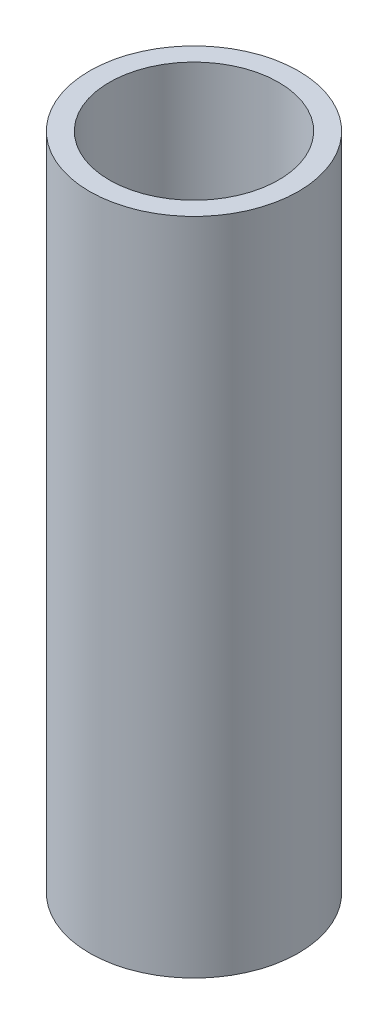
ISO-10303-21;
HEADER;
FILE_DESCRIPTION(('STEP AP214'),'2;1');
FILE_NAME('part.step','',(''),(''),'','','');
FILE_SCHEMA(('AUTOMOTIVE_DESIGN { 1 0 10303 214 1 1 1 1 }'));
ENDSEC;
DATA;
#1=APPLICATION_CONTEXT('core data for automotive mechanical design processes');
#2=APPLICATION_PROTOCOL_DEFINITION('international standard','automotive_design',2000,#1);
#3=PRODUCT_CONTEXT('',#1,'mechanical');
#4=PRODUCT('Part','Part','',(#3));
#5=PRODUCT_RELATED_PRODUCT_CATEGORY('part','',(#4));
#6=PRODUCT_DEFINITION_FORMATION('','',#4);
#7=PRODUCT_DEFINITION_CONTEXT('part definition',#1,'design');
#8=PRODUCT_DEFINITION('design','',#6,#7);
#9=PRODUCT_DEFINITION_SHAPE('','',#8);
#10=(LENGTH_UNIT() NAMED_UNIT(*) SI_UNIT(.MILLI.,.METRE.));
#11=(NAMED_UNIT(*) PLANE_ANGLE_UNIT() SI_UNIT($,.RADIAN.));
#12=(NAMED_UNIT(*) SI_UNIT($,.STERADIAN.) SOLID_ANGLE_UNIT());
#13=UNCERTAINTY_MEASURE_WITH_UNIT(LENGTH_MEASURE(1.E-05),#10,'distance_accuracy_value','');
#14=(GEOMETRIC_REPRESENTATION_CONTEXT(3) GLOBAL_UNCERTAINTY_ASSIGNED_CONTEXT((#13)) GLOBAL_UNIT_ASSIGNED_CONTEXT((#10,
#11,#12)) REPRESENTATION_CONTEXT('',''));
#15=CARTESIAN_POINT('',(0.,0.,0.));
#16=DIRECTION('',(0.,0.,1.));
#17=DIRECTION('',(1.,0.,0.));
#18=AXIS2_PLACEMENT_3D('',#15,#16,#17);
#19=CARTESIAN_POINT('',(0.,15.,0.));
#20=DIRECTION('',(0.,1.,0.));
#21=DIRECTION('',(0.,0.,1.));
#22=AXIS2_PLACEMENT_3D('',#19,#20,#21);
#23=PLANE('',#22);
#24=CARTESIAN_POINT('',(0.,15.,0.));
#25=DIRECTION('',(0.,1.,0.));
#26=DIRECTION('',(0.,0.,1.));
#27=AXIS2_PLACEMENT_3D('',#24,#25,#26);
#28=CIRCLE('',#27,2.375);
#29=CARTESIAN_POINT('',(0.,15.,2.375));
#30=VERTEX_POINT('',#29);
#31=EDGE_CURVE('E10',#30,#30,#28,.T.);
#32=ORIENTED_EDGE('',*,*,#31,.T.);
#33=EDGE_LOOP('',(#32));
#34=FACE_BOUND('',#33,.T.);
#35=CARTESIAN_POINT('',(0.,15.,0.));
#36=DIRECTION('',(0.,1.,0.));
#37=DIRECTION('',(0.,0.,1.));
#38=AXIS2_PLACEMENT_3D('',#35,#36,#37);
#39=CIRCLE('',#38,1.925);
#40=CARTESIAN_POINT('',(0.,15.,1.925));
#41=VERTEX_POINT('',#40);
#42=EDGE_CURVE('E46',#41,#41,#39,.T.);
#43=ORIENTED_EDGE('',*,*,#42,.F.);
#44=EDGE_LOOP('',(#43));
#45=FACE_BOUND('',#44,.T.);
#46=ADVANCED_FACE('F35',(#34,#45),#23,.T.);
#47=CARTESIAN_POINT('',(0.,0.,0.));
#48=DIRECTION('',(0.,1.,0.));
#49=DIRECTION('',(0.,0.,1.));
#50=AXIS2_PLACEMENT_3D('',#47,#48,#49);
#51=PLANE('',#50);
#52=CARTESIAN_POINT('',(0.,0.,0.));
#53=DIRECTION('',(0.,1.,0.));
#54=DIRECTION('',(0.,0.,1.));
#55=AXIS2_PLACEMENT_3D('',#52,#53,#54);
#56=CIRCLE('',#55,2.375);
#57=CARTESIAN_POINT('',(0.,0.,2.375));
#58=VERTEX_POINT('',#57);
#59=EDGE_CURVE('E39',#58,#58,#56,.T.);
#60=ORIENTED_EDGE('',*,*,#59,.F.);
#61=EDGE_LOOP('',(#60));
#62=FACE_BOUND('',#61,.T.);
#63=CARTESIAN_POINT('',(0.,0.,0.));
#64=DIRECTION('',(0.,1.,0.));
#65=DIRECTION('',(0.,0.,1.));
#66=AXIS2_PLACEMENT_3D('',#63,#64,#65);
#67=CIRCLE('',#66,1.925);
#68=CARTESIAN_POINT('',(0.,0.,1.925));
#69=VERTEX_POINT('',#68);
#70=EDGE_CURVE('E48',#69,#69,#67,.T.);
#71=ORIENTED_EDGE('',*,*,#70,.T.);
#72=EDGE_LOOP('',(#71));
#73=FACE_BOUND('',#72,.T.);
#74=ADVANCED_FACE('F58',(#62,#73),#51,.F.);
#75=CARTESIAN_POINT('',(0.,15.,0.));
#76=DIRECTION('',(0.,-1.,0.));
#77=DIRECTION('',(0.,0.,-1.));
#78=AXIS2_PLACEMENT_3D('',#75,#76,#77);
#79=CYLINDRICAL_SURFACE('',#78,2.375);
#80=ORIENTED_EDGE('',*,*,#31,.F.);
#81=EDGE_LOOP('',(#80));
#82=FACE_BOUND('',#81,.T.);
#83=ORIENTED_EDGE('',*,*,#59,.T.);
#84=EDGE_LOOP('',(#83));
#85=FACE_BOUND('',#84,.T.);
#86=ADVANCED_FACE('F37',(#82,#85),#79,.T.);
#87=CARTESIAN_POINT('',(0.,15.,0.));
#88=DIRECTION('',(0.,-1.,0.));
#89=DIRECTION('',(0.,0.,-1.));
#90=AXIS2_PLACEMENT_3D('',#87,#88,#89);
#91=CYLINDRICAL_SURFACE('',#90,1.925);
#92=ORIENTED_EDGE('',*,*,#42,.T.);
#93=EDGE_LOOP('',(#92));
#94=FACE_BOUND('',#93,.T.);
#95=ORIENTED_EDGE('',*,*,#70,.F.);
#96=EDGE_LOOP('',(#95));
#97=FACE_BOUND('',#96,.T.);
#98=ADVANCED_FACE('F54',(#94,#97),#91,.F.);
#99=CLOSED_SHELL('',(#46,#74,#86,#98));
#100=MANIFOLD_SOLID_BREP('B2',#99);
#101=ADVANCED_BREP_SHAPE_REPRESENTATION('',(#18,#100),#14);
#102=SHAPE_DEFINITION_REPRESENTATION(#9,#101);
ENDSEC;
END-ISO-10303-21;
